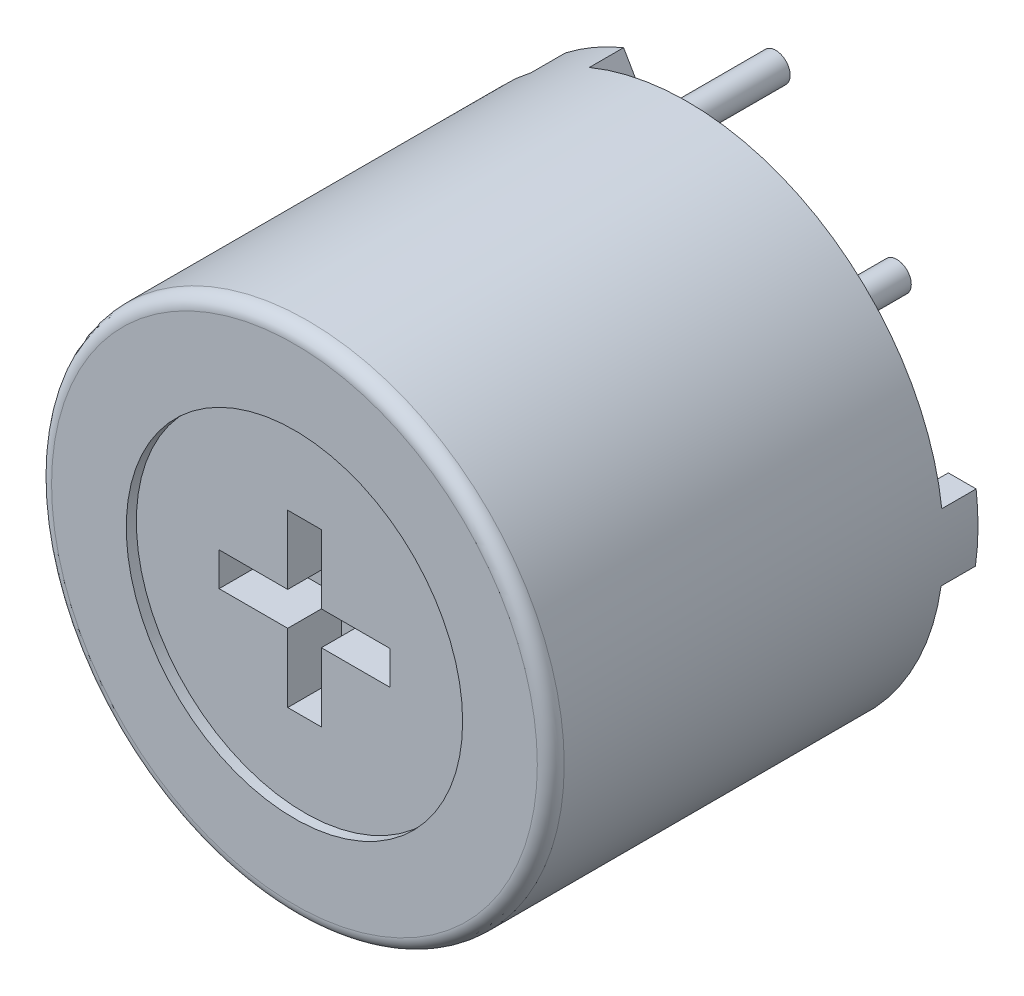
ISO-10303-21;
HEADER;
FILE_DESCRIPTION(('STEP AP214'),'2;1');
FILE_NAME('part.step','',(''),(''),'','','');
FILE_SCHEMA(('AUTOMOTIVE_DESIGN { 1 0 10303 214 1 1 1 1 }'));
ENDSEC;
DATA;
#1=APPLICATION_CONTEXT('core data for automotive mechanical design processes');
#2=APPLICATION_PROTOCOL_DEFINITION('international standard','automotive_design',2000,#1);
#3=PRODUCT_CONTEXT('',#1,'mechanical');
#4=PRODUCT('Part','Part','',(#3));
#5=PRODUCT_RELATED_PRODUCT_CATEGORY('part','',(#4));
#6=PRODUCT_DEFINITION_FORMATION('','',#4);
#7=PRODUCT_DEFINITION_CONTEXT('part definition',#1,'design');
#8=PRODUCT_DEFINITION('design','',#6,#7);
#9=PRODUCT_DEFINITION_SHAPE('','',#8);
#10=(LENGTH_UNIT() NAMED_UNIT(*) SI_UNIT(.MILLI.,.METRE.));
#11=(NAMED_UNIT(*) PLANE_ANGLE_UNIT() SI_UNIT($,.RADIAN.));
#12=(NAMED_UNIT(*) SI_UNIT($,.STERADIAN.) SOLID_ANGLE_UNIT());
#13=UNCERTAINTY_MEASURE_WITH_UNIT(LENGTH_MEASURE(1.E-05),#10,'distance_accuracy_value','');
#14=(GEOMETRIC_REPRESENTATION_CONTEXT(3) GLOBAL_UNCERTAINTY_ASSIGNED_CONTEXT((#13)) GLOBAL_UNIT_ASSIGNED_CONTEXT((#10,
#11,#12)) REPRESENTATION_CONTEXT('',''));
#15=CARTESIAN_POINT('',(0.,0.,0.));
#16=DIRECTION('',(0.,0.,1.));
#17=DIRECTION('',(1.,0.,0.));
#18=AXIS2_PLACEMENT_3D('',#15,#16,#17);
#19=CARTESIAN_POINT('',(80.627,48.84,6.9));
#20=DIRECTION('',(0.,0.,1.));
#21=DIRECTION('',(1.,0.,0.));
#22=AXIS2_PLACEMENT_3D('',#19,#20,#21);
#23=PLANE('',#22);
#24=DIRECTION('',(1.,0.,0.));
#25=VECTOR('',#24,1.);
#26=CARTESIAN_POINT('',(80.627,48.84,6.9));
#27=LINE('',#26,#25);
#28=CARTESIAN_POINT('',(83.167,48.84,6.9));
#29=VERTEX_POINT('',#28);
#30=CARTESIAN_POINT('',(82.147,48.84,6.9));
#31=VERTEX_POINT('',#30);
#32=EDGE_CURVE('E404',#29,#31,#27,.F.);
#33=ORIENTED_EDGE('',*,*,#32,.F.);
#34=DIRECTION('',(0.,1.,0.));
#35=VECTOR('',#34,1.);
#36=CARTESIAN_POINT('',(83.167,48.84,6.9));
#37=LINE('',#36,#35);
#38=CARTESIAN_POINT('',(83.167,49.34,6.9));
#39=VERTEX_POINT('',#38);
#40=EDGE_CURVE('E410',#29,#39,#37,.T.);
#41=ORIENTED_EDGE('',*,*,#40,.T.);
#42=DIRECTION('',(1.,0.,0.));
#43=VECTOR('',#42,1.);
#44=CARTESIAN_POINT('',(80.627,49.34,6.9));
#45=LINE('',#44,#43);
#46=CARTESIAN_POINT('',(82.147,49.34,6.9));
#47=VERTEX_POINT('',#46);
#48=EDGE_CURVE('E416',#39,#47,#45,.F.);
#49=ORIENTED_EDGE('',*,*,#48,.T.);
#50=DIRECTION('',(0.,1.,0.));
#51=VECTOR('',#50,1.);
#52=CARTESIAN_POINT('',(82.147,47.82,6.9));
#53=LINE('',#52,#51);
#54=CARTESIAN_POINT('',(82.147,50.36,6.9));
#55=VERTEX_POINT('',#54);
#56=EDGE_CURVE('E422',#47,#55,#53,.T.);
#57=ORIENTED_EDGE('',*,*,#56,.T.);
#58=DIRECTION('',(1.,0.,0.));
#59=VECTOR('',#58,1.);
#60=CARTESIAN_POINT('',(81.647,50.36,6.9));
#61=LINE('',#60,#59);
#62=CARTESIAN_POINT('',(81.647,50.36,6.9));
#63=VERTEX_POINT('',#62);
#64=EDGE_CURVE('E428',#55,#63,#61,.F.);
#65=ORIENTED_EDGE('',*,*,#64,.T.);
#66=DIRECTION('',(0.,1.,0.));
#67=VECTOR('',#66,1.);
#68=CARTESIAN_POINT('',(81.647,47.82,6.9));
#69=LINE('',#68,#67);
#70=CARTESIAN_POINT('',(81.647,49.34,6.9));
#71=VERTEX_POINT('',#70);
#72=EDGE_CURVE('E431',#71,#63,#69,.T.);
#73=ORIENTED_EDGE('',*,*,#72,.F.);
#74=DIRECTION('',(1.,0.,0.));
#75=VECTOR('',#74,1.);
#76=CARTESIAN_POINT('',(80.627,49.34,6.9));
#77=LINE('',#76,#75);
#78=CARTESIAN_POINT('',(80.627,49.34,6.9));
#79=VERTEX_POINT('',#78);
#80=EDGE_CURVE('E440',#71,#79,#77,.F.);
#81=ORIENTED_EDGE('',*,*,#80,.T.);
#82=DIRECTION('',(0.,1.,0.));
#83=VECTOR('',#82,1.);
#84=CARTESIAN_POINT('',(80.627,48.84,6.9));
#85=LINE('',#84,#83);
#86=CARTESIAN_POINT('',(80.627,48.84,6.9));
#87=VERTEX_POINT('',#86);
#88=EDGE_CURVE('E443',#87,#79,#85,.T.);
#89=ORIENTED_EDGE('',*,*,#88,.F.);
#90=DIRECTION('',(1.,0.,0.));
#91=VECTOR('',#90,1.);
#92=CARTESIAN_POINT('',(80.627,48.84,6.9));
#93=LINE('',#92,#91);
#94=CARTESIAN_POINT('',(81.647,48.84,6.9));
#95=VERTEX_POINT('',#94);
#96=EDGE_CURVE('E452',#95,#87,#93,.F.);
#97=ORIENTED_EDGE('',*,*,#96,.F.);
#98=DIRECTION('',(0.,1.,0.));
#99=VECTOR('',#98,1.);
#100=CARTESIAN_POINT('',(81.647,47.82,6.9));
#101=LINE('',#100,#99);
#102=CARTESIAN_POINT('',(81.647,47.82,6.9));
#103=VERTEX_POINT('',#102);
#104=EDGE_CURVE('E455',#103,#95,#101,.T.);
#105=ORIENTED_EDGE('',*,*,#104,.F.);
#106=DIRECTION('',(1.,0.,0.));
#107=VECTOR('',#106,1.);
#108=CARTESIAN_POINT('',(81.647,47.82,6.9));
#109=LINE('',#108,#107);
#110=CARTESIAN_POINT('',(82.147,47.82,6.9));
#111=VERTEX_POINT('',#110);
#112=EDGE_CURVE('E461',#111,#103,#109,.F.);
#113=ORIENTED_EDGE('',*,*,#112,.F.);
#114=DIRECTION('',(0.,1.,0.));
#115=VECTOR('',#114,1.);
#116=CARTESIAN_POINT('',(82.147,47.82,6.9));
#117=LINE('',#116,#115);
#118=EDGE_CURVE('E467',#111,#31,#117,.T.);
#119=ORIENTED_EDGE('',*,*,#118,.T.);
#120=EDGE_LOOP('',(#33,#41,#49,#57,#65,#73,#81,#89,#97,#105,#113,#119));
#121=FACE_BOUND('',#120,.T.);
#122=ADVANCED_FACE('F17',(#121),#23,.T.);
#123=CARTESIAN_POINT('',(81.88,49.08,-1.1));
#124=DIRECTION('',(0.,0.,1.));
#125=DIRECTION('',(1.,0.,0.));
#126=AXIS2_PLACEMENT_3D('',#123,#124,#125);
#127=PLANE('',#126);
#128=CARTESIAN_POINT('',(81.9,49.1,-1.1));
#129=DIRECTION('',(0.,0.,1.));
#130=DIRECTION('',(1.,0.,0.));
#131=AXIS2_PLACEMENT_3D('',#128,#129,#130);
#132=CIRCLE('',#131,0.215);
#133=CARTESIAN_POINT('',(82.115,49.1,-1.1));
#134=VERTEX_POINT('',#133);
#135=EDGE_CURVE('E20',#134,#134,#132,.T.);
#136=ORIENTED_EDGE('',*,*,#135,.F.);
#137=EDGE_LOOP('',(#136));
#138=FACE_BOUND('',#137,.T.);
#139=ADVANCED_FACE('F268',(#138),#127,.F.);
#140=CARTESIAN_POINT('',(82.147,47.82,6.9));
#141=DIRECTION('',(1.,0.,0.));
#142=DIRECTION('',(0.,0.,-1.));
#143=AXIS2_PLACEMENT_3D('',#140,#141,#142);
#144=PLANE('',#143);
#145=DIRECTION('',(0.,0.,1.));
#146=VECTOR('',#145,1.);
#147=CARTESIAN_POINT('',(82.147,48.84,6.9));
#148=LINE('',#147,#146);
#149=CARTESIAN_POINT('',(82.147,48.84,7.7));
#150=VERTEX_POINT('',#149);
#151=EDGE_CURVE('E401',#31,#150,#148,.T.);
#152=ORIENTED_EDGE('',*,*,#151,.F.);
#153=ORIENTED_EDGE('',*,*,#118,.F.);
#154=DIRECTION('',(0.,0.,1.));
#155=VECTOR('',#154,1.);
#156=CARTESIAN_POINT('',(82.147,47.82,6.9));
#157=LINE('',#156,#155);
#158=CARTESIAN_POINT('',(82.147,47.82,7.7));
#159=VERTEX_POINT('',#158);
#160=EDGE_CURVE('E464',#159,#111,#157,.F.);
#161=ORIENTED_EDGE('',*,*,#160,.F.);
#162=DIRECTION('',(0.,1.,0.));
#163=VECTOR('',#162,1.);
#164=CARTESIAN_POINT('',(82.147,49.09,7.7));
#165=LINE('',#164,#163);
#166=EDGE_CURVE('E396',#150,#159,#165,.F.);
#167=ORIENTED_EDGE('',*,*,#166,.F.);
#168=EDGE_LOOP('',(#152,#153,#161,#167));
#169=FACE_BOUND('',#168,.T.);
#170=ADVANCED_FACE('F265',(#169),#144,.F.);
#171=CARTESIAN_POINT('',(81.647,47.82,6.9));
#172=DIRECTION('',(0.,1.,0.));
#173=DIRECTION('',(0.,0.,1.));
#174=AXIS2_PLACEMENT_3D('',#171,#172,#173);
#175=PLANE('',#174);
#176=DIRECTION('',(0.,0.,-1.));
#177=VECTOR('',#176,1.);
#178=CARTESIAN_POINT('',(81.647,47.82,6.9));
#179=LINE('',#178,#177);
#180=CARTESIAN_POINT('',(81.647,47.82,7.7));
#181=VERTEX_POINT('',#180);
#182=EDGE_CURVE('E458',#181,#103,#179,.T.);
#183=ORIENTED_EDGE('',*,*,#182,.F.);
#184=DIRECTION('',(1.,0.,0.));
#185=VECTOR('',#184,1.);
#186=CARTESIAN_POINT('',(81.897,47.82,7.7));
#187=LINE('',#186,#185);
#188=EDGE_CURVE('E393',#159,#181,#187,.F.);
#189=ORIENTED_EDGE('',*,*,#188,.F.);
#190=ORIENTED_EDGE('',*,*,#160,.T.);
#191=ORIENTED_EDGE('',*,*,#112,.T.);
#192=EDGE_LOOP('',(#183,#189,#190,#191));
#193=FACE_BOUND('',#192,.T.);
#194=ADVANCED_FACE('F261',(#193),#175,.T.);
#195=CARTESIAN_POINT('',(81.647,47.82,6.9));
#196=DIRECTION('',(1.,0.,0.));
#197=DIRECTION('',(0.,0.,-1.));
#198=AXIS2_PLACEMENT_3D('',#195,#196,#197);
#199=PLANE('',#198);
#200=DIRECTION('',(0.,0.,1.));
#201=VECTOR('',#200,1.);
#202=CARTESIAN_POINT('',(81.647,48.84,6.9));
#203=LINE('',#202,#201);
#204=CARTESIAN_POINT('',(81.647,48.84,7.7));
#205=VERTEX_POINT('',#204);
#206=EDGE_CURVE('E449',#205,#95,#203,.F.);
#207=ORIENTED_EDGE('',*,*,#206,.F.);
#208=DIRECTION('',(0.,1.,0.));
#209=VECTOR('',#208,1.);
#210=CARTESIAN_POINT('',(81.647,49.09,7.7));
#211=LINE('',#210,#209);
#212=EDGE_CURVE('E390',#181,#205,#211,.T.);
#213=ORIENTED_EDGE('',*,*,#212,.F.);
#214=ORIENTED_EDGE('',*,*,#182,.T.);
#215=ORIENTED_EDGE('',*,*,#104,.T.);
#216=EDGE_LOOP('',(#207,#213,#214,#215));
#217=FACE_BOUND('',#216,.T.);
#218=ADVANCED_FACE('F257',(#217),#199,.T.);
#219=CARTESIAN_POINT('',(80.627,48.84,6.9));
#220=DIRECTION('',(0.,1.,0.));
#221=DIRECTION('',(0.,0.,1.));
#222=AXIS2_PLACEMENT_3D('',#219,#220,#221);
#223=PLANE('',#222);
#224=DIRECTION('',(1.,0.,0.));
#225=VECTOR('',#224,1.);
#226=CARTESIAN_POINT('',(81.897,48.84,7.7));
#227=LINE('',#226,#225);
#228=CARTESIAN_POINT('',(80.627,48.84,7.7));
#229=VERTEX_POINT('',#228);
#230=EDGE_CURVE('E387',#205,#229,#227,.F.);
#231=ORIENTED_EDGE('',*,*,#230,.F.);
#232=ORIENTED_EDGE('',*,*,#206,.T.);
#233=ORIENTED_EDGE('',*,*,#96,.T.);
#234=DIRECTION('',(0.,0.,-1.));
#235=VECTOR('',#234,1.);
#236=CARTESIAN_POINT('',(80.627,48.84,6.9));
#237=LINE('',#236,#235);
#238=EDGE_CURVE('E446',#229,#87,#237,.T.);
#239=ORIENTED_EDGE('',*,*,#238,.F.);
#240=EDGE_LOOP('',(#231,#232,#233,#239));
#241=FACE_BOUND('',#240,.T.);
#242=ADVANCED_FACE('F253',(#241),#223,.T.);
#243=CARTESIAN_POINT('',(80.627,48.84,6.9));
#244=DIRECTION('',(1.,0.,0.));
#245=DIRECTION('',(0.,0.,-1.));
#246=AXIS2_PLACEMENT_3D('',#243,#244,#245);
#247=PLANE('',#246);
#248=DIRECTION('',(0.,0.,1.));
#249=VECTOR('',#248,1.);
#250=CARTESIAN_POINT('',(80.627,49.34,6.9));
#251=LINE('',#250,#249);
#252=CARTESIAN_POINT('',(80.627,49.34,7.7));
#253=VERTEX_POINT('',#252);
#254=EDGE_CURVE('E437',#79,#253,#251,.T.);
#255=ORIENTED_EDGE('',*,*,#254,.T.);
#256=DIRECTION('',(0.,1.,0.));
#257=VECTOR('',#256,1.);
#258=CARTESIAN_POINT('',(80.627,49.09,7.7));
#259=LINE('',#258,#257);
#260=EDGE_CURVE('E384',#229,#253,#259,.T.);
#261=ORIENTED_EDGE('',*,*,#260,.F.);
#262=ORIENTED_EDGE('',*,*,#238,.T.);
#263=ORIENTED_EDGE('',*,*,#88,.T.);
#264=EDGE_LOOP('',(#255,#261,#262,#263));
#265=FACE_BOUND('',#264,.T.);
#266=ADVANCED_FACE('F249',(#265),#247,.T.);
#267=CARTESIAN_POINT('',(80.627,49.34,6.9));
#268=DIRECTION('',(0.,1.,0.));
#269=DIRECTION('',(0.,0.,1.));
#270=AXIS2_PLACEMENT_3D('',#267,#268,#269);
#271=PLANE('',#270);
#272=DIRECTION('',(1.,0.,0.));
#273=VECTOR('',#272,1.);
#274=CARTESIAN_POINT('',(81.897,49.34,7.7));
#275=LINE('',#274,#273);
#276=CARTESIAN_POINT('',(81.647,49.34,7.7));
#277=VERTEX_POINT('',#276);
#278=EDGE_CURVE('E381',#253,#277,#275,.T.);
#279=ORIENTED_EDGE('',*,*,#278,.F.);
#280=ORIENTED_EDGE('',*,*,#254,.F.);
#281=ORIENTED_EDGE('',*,*,#80,.F.);
#282=DIRECTION('',(0.,0.,-1.));
#283=VECTOR('',#282,1.);
#284=CARTESIAN_POINT('',(81.647,49.34,6.9));
#285=LINE('',#284,#283);
#286=EDGE_CURVE('E434',#277,#71,#285,.T.);
#287=ORIENTED_EDGE('',*,*,#286,.F.);
#288=EDGE_LOOP('',(#279,#280,#281,#287));
#289=FACE_BOUND('',#288,.T.);
#290=ADVANCED_FACE('F245',(#289),#271,.F.);
#291=CARTESIAN_POINT('',(81.647,47.82,6.9));
#292=DIRECTION('',(1.,0.,0.));
#293=DIRECTION('',(0.,0.,-1.));
#294=AXIS2_PLACEMENT_3D('',#291,#292,#293);
#295=PLANE('',#294);
#296=DIRECTION('',(0.,0.,1.));
#297=VECTOR('',#296,1.);
#298=CARTESIAN_POINT('',(81.647,50.36,6.9));
#299=LINE('',#298,#297);
#300=CARTESIAN_POINT('',(81.647,50.36,7.7));
#301=VERTEX_POINT('',#300);
#302=EDGE_CURVE('E425',#63,#301,#299,.T.);
#303=ORIENTED_EDGE('',*,*,#302,.T.);
#304=DIRECTION('',(0.,1.,0.));
#305=VECTOR('',#304,1.);
#306=CARTESIAN_POINT('',(81.647,49.09,7.7));
#307=LINE('',#306,#305);
#308=EDGE_CURVE('E378',#277,#301,#307,.T.);
#309=ORIENTED_EDGE('',*,*,#308,.F.);
#310=ORIENTED_EDGE('',*,*,#286,.T.);
#311=ORIENTED_EDGE('',*,*,#72,.T.);
#312=EDGE_LOOP('',(#303,#309,#310,#311));
#313=FACE_BOUND('',#312,.T.);
#314=ADVANCED_FACE('F241',(#313),#295,.T.);
#315=CARTESIAN_POINT('',(81.647,50.36,6.9));
#316=DIRECTION('',(0.,1.,0.));
#317=DIRECTION('',(0.,0.,1.));
#318=AXIS2_PLACEMENT_3D('',#315,#316,#317);
#319=PLANE('',#318);
#320=ORIENTED_EDGE('',*,*,#302,.F.);
#321=ORIENTED_EDGE('',*,*,#64,.F.);
#322=DIRECTION('',(0.,0.,-1.));
#323=VECTOR('',#322,1.);
#324=CARTESIAN_POINT('',(82.147,50.36,6.9));
#325=LINE('',#324,#323);
#326=CARTESIAN_POINT('',(82.147,50.36,7.7));
#327=VERTEX_POINT('',#326);
#328=EDGE_CURVE('E419',#55,#327,#325,.F.);
#329=ORIENTED_EDGE('',*,*,#328,.T.);
#330=DIRECTION('',(1.,0.,0.));
#331=VECTOR('',#330,1.);
#332=CARTESIAN_POINT('',(81.897,50.36,7.7));
#333=LINE('',#332,#331);
#334=EDGE_CURVE('E375',#301,#327,#333,.T.);
#335=ORIENTED_EDGE('',*,*,#334,.F.);
#336=EDGE_LOOP('',(#320,#321,#329,#335));
#337=FACE_BOUND('',#336,.T.);
#338=ADVANCED_FACE('F237',(#337),#319,.F.);
#339=CARTESIAN_POINT('',(82.147,47.82,6.9));
#340=DIRECTION('',(1.,0.,0.));
#341=DIRECTION('',(0.,0.,-1.));
#342=AXIS2_PLACEMENT_3D('',#339,#340,#341);
#343=PLANE('',#342);
#344=ORIENTED_EDGE('',*,*,#328,.F.);
#345=ORIENTED_EDGE('',*,*,#56,.F.);
#346=DIRECTION('',(0.,0.,1.));
#347=VECTOR('',#346,1.);
#348=CARTESIAN_POINT('',(82.147,49.34,6.9));
#349=LINE('',#348,#347);
#350=CARTESIAN_POINT('',(82.147,49.34,7.7));
#351=VERTEX_POINT('',#350);
#352=EDGE_CURVE('E413',#47,#351,#349,.T.);
#353=ORIENTED_EDGE('',*,*,#352,.T.);
#354=DIRECTION('',(0.,1.,0.));
#355=VECTOR('',#354,1.);
#356=CARTESIAN_POINT('',(82.147,49.09,7.7));
#357=LINE('',#356,#355);
#358=EDGE_CURVE('E372',#327,#351,#357,.F.);
#359=ORIENTED_EDGE('',*,*,#358,.F.);
#360=EDGE_LOOP('',(#344,#345,#353,#359));
#361=FACE_BOUND('',#360,.T.);
#362=ADVANCED_FACE('F233',(#361),#343,.F.);
#363=CARTESIAN_POINT('',(80.627,49.34,6.9));
#364=DIRECTION('',(0.,1.,0.));
#365=DIRECTION('',(0.,0.,1.));
#366=AXIS2_PLACEMENT_3D('',#363,#364,#365);
#367=PLANE('',#366);
#368=DIRECTION('',(1.,0.,0.));
#369=VECTOR('',#368,1.);
#370=CARTESIAN_POINT('',(81.897,49.34,7.7));
#371=LINE('',#370,#369);
#372=CARTESIAN_POINT('',(83.167,49.34,7.7));
#373=VERTEX_POINT('',#372);
#374=EDGE_CURVE('E366',#351,#373,#371,.T.);
#375=ORIENTED_EDGE('',*,*,#374,.F.);
#376=ORIENTED_EDGE('',*,*,#352,.F.);
#377=ORIENTED_EDGE('',*,*,#48,.F.);
#378=DIRECTION('',(0.,0.,-1.));
#379=VECTOR('',#378,1.);
#380=CARTESIAN_POINT('',(83.167,49.34,6.9));
#381=LINE('',#380,#379);
#382=EDGE_CURVE('E407',#39,#373,#381,.F.);
#383=ORIENTED_EDGE('',*,*,#382,.T.);
#384=EDGE_LOOP('',(#375,#376,#377,#383));
#385=FACE_BOUND('',#384,.T.);
#386=ADVANCED_FACE('F229',(#385),#367,.F.);
#387=CARTESIAN_POINT('',(83.167,48.84,6.9));
#388=DIRECTION('',(1.,0.,0.));
#389=DIRECTION('',(0.,0.,-1.));
#390=AXIS2_PLACEMENT_3D('',#387,#388,#389);
#391=PLANE('',#390);
#392=ORIENTED_EDGE('',*,*,#382,.F.);
#393=ORIENTED_EDGE('',*,*,#40,.F.);
#394=DIRECTION('',(0.,0.,1.));
#395=VECTOR('',#394,1.);
#396=CARTESIAN_POINT('',(83.167,48.84,6.9));
#397=LINE('',#396,#395);
#398=CARTESIAN_POINT('',(83.167,48.84,7.7));
#399=VERTEX_POINT('',#398);
#400=EDGE_CURVE('E398',#399,#29,#397,.F.);
#401=ORIENTED_EDGE('',*,*,#400,.F.);
#402=DIRECTION('',(0.,1.,0.));
#403=VECTOR('',#402,1.);
#404=CARTESIAN_POINT('',(83.167,49.09,7.7));
#405=LINE('',#404,#403);
#406=EDGE_CURVE('E360',#373,#399,#405,.F.);
#407=ORIENTED_EDGE('',*,*,#406,.F.);
#408=EDGE_LOOP('',(#392,#393,#401,#407));
#409=FACE_BOUND('',#408,.T.);
#410=ADVANCED_FACE('F225',(#409),#391,.F.);
#411=CARTESIAN_POINT('',(80.627,48.84,6.9));
#412=DIRECTION('',(0.,1.,0.));
#413=DIRECTION('',(0.,0.,1.));
#414=AXIS2_PLACEMENT_3D('',#411,#412,#413);
#415=PLANE('',#414);
#416=DIRECTION('',(1.,0.,0.));
#417=VECTOR('',#416,1.);
#418=CARTESIAN_POINT('',(81.897,48.84,7.7));
#419=LINE('',#418,#417);
#420=EDGE_CURVE('E356',#399,#150,#419,.F.);
#421=ORIENTED_EDGE('',*,*,#420,.F.);
#422=ORIENTED_EDGE('',*,*,#400,.T.);
#423=ORIENTED_EDGE('',*,*,#32,.T.);
#424=ORIENTED_EDGE('',*,*,#151,.T.);
#425=EDGE_LOOP('',(#421,#422,#423,#424));
#426=FACE_BOUND('',#425,.T.);
#427=ADVANCED_FACE('F221',(#426),#415,.T.);
#428=CARTESIAN_POINT('',(81.88,49.08,-1.1));
#429=DIRECTION('',(0.,0.,1.));
#430=DIRECTION('',(1.,0.,0.));
#431=AXIS2_PLACEMENT_3D('',#428,#429,#430);
#432=PLANE('',#431);
#433=CARTESIAN_POINT('',(80.1,50.8921,-1.1));
#434=DIRECTION('',(0.,0.,1.));
#435=DIRECTION('',(1.,0.,0.));
#436=AXIS2_PLACEMENT_3D('',#433,#434,#435);
#437=CIRCLE('',#436,0.215);
#438=CARTESIAN_POINT('',(80.315,50.8921,-1.1));
#439=VERTEX_POINT('',#438);
#440=EDGE_CURVE('E354',#439,#439,#437,.T.);
#441=ORIENTED_EDGE('',*,*,#440,.F.);
#442=EDGE_LOOP('',(#441));
#443=FACE_BOUND('',#442,.T.);
#444=ADVANCED_FACE('F217',(#443),#432,.F.);
#445=CARTESIAN_POINT('',(81.88,49.08,-1.1));
#446=DIRECTION('',(0.,0.,1.));
#447=DIRECTION('',(1.,0.,0.));
#448=AXIS2_PLACEMENT_3D('',#445,#446,#447);
#449=PLANE('',#448);
#450=CARTESIAN_POINT('',(80.1,47.3,-1.1));
#451=DIRECTION('',(0.,0.,1.));
#452=DIRECTION('',(1.,0.,0.));
#453=AXIS2_PLACEMENT_3D('',#450,#451,#452);
#454=CIRCLE('',#453,0.215);
#455=CARTESIAN_POINT('',(80.315,47.3,-1.1));
#456=VERTEX_POINT('',#455);
#457=EDGE_CURVE('E352',#456,#456,#454,.T.);
#458=ORIENTED_EDGE('',*,*,#457,.F.);
#459=EDGE_LOOP('',(#458));
#460=FACE_BOUND('',#459,.T.);
#461=ADVANCED_FACE('F213',(#460),#449,.F.);
#462=CARTESIAN_POINT('',(81.9,49.1,-3.28));
#463=DIRECTION('',(0.,0.,1.));
#464=DIRECTION('',(1.,0.,0.));
#465=AXIS2_PLACEMENT_3D('',#462,#463,#464);
#466=CYLINDRICAL_SURFACE('',#465,0.215);
#467=CARTESIAN_POINT('',(81.9,49.1,2.01));
#468=DIRECTION('',(0.,0.,1.));
#469=DIRECTION('',(1.,0.,0.));
#470=AXIS2_PLACEMENT_3D('',#467,#468,#469);
#471=CIRCLE('',#470,0.215);
#472=CARTESIAN_POINT('',(82.115,49.1,2.01));
#473=VERTEX_POINT('',#472);
#474=EDGE_CURVE('E349',#473,#473,#471,.F.);
#475=ORIENTED_EDGE('',*,*,#474,.T.);
#476=EDGE_LOOP('',(#475));
#477=FACE_BOUND('',#476,.T.);
#478=ORIENTED_EDGE('',*,*,#135,.T.);
#479=EDGE_LOOP('',(#478));
#480=FACE_BOUND('',#479,.T.);
#481=ADVANCED_FACE('F209',(#477,#480),#466,.T.);
#482=CARTESIAN_POINT('',(81.897,49.09,7.7));
#483=DIRECTION('',(0.,0.,1.));
#484=DIRECTION('',(1.,0.,0.));
#485=AXIS2_PLACEMENT_3D('',#482,#483,#484);
#486=PLANE('',#485);
#487=ORIENTED_EDGE('',*,*,#406,.T.);
#488=ORIENTED_EDGE('',*,*,#420,.T.);
#489=ORIENTED_EDGE('',*,*,#166,.T.);
#490=ORIENTED_EDGE('',*,*,#188,.T.);
#491=ORIENTED_EDGE('',*,*,#212,.T.);
#492=ORIENTED_EDGE('',*,*,#230,.T.);
#493=ORIENTED_EDGE('',*,*,#260,.T.);
#494=ORIENTED_EDGE('',*,*,#278,.T.);
#495=ORIENTED_EDGE('',*,*,#308,.T.);
#496=ORIENTED_EDGE('',*,*,#334,.T.);
#497=ORIENTED_EDGE('',*,*,#358,.T.);
#498=ORIENTED_EDGE('',*,*,#374,.T.);
#499=EDGE_LOOP('',(#487,#488,#489,#490,#491,#492,#493,#494,#495,#496,#497,#498));
#500=FACE_BOUND('',#499,.T.);
#501=CARTESIAN_POINT('',(81.897,49.09,7.7));
#502=DIRECTION('',(0.,0.,1.));
#503=DIRECTION('',(1.,0.,0.));
#504=AXIS2_PLACEMENT_3D('',#501,#502,#503);
#505=CIRCLE('',#504,2.5);
#506=CARTESIAN_POINT('',(84.397,49.09,7.7));
#507=VERTEX_POINT('',#506);
#508=EDGE_CURVE('E119',#507,#507,#505,.T.);
#509=ORIENTED_EDGE('',*,*,#508,.T.);
#510=EDGE_LOOP('',(#509));
#511=FACE_BOUND('',#510,.T.);
#512=ADVANCED_FACE('F205',(#500,#511),#486,.T.);
#513=CARTESIAN_POINT('',(80.1,50.8921,-3.28));
#514=DIRECTION('',(0.,0.,1.));
#515=DIRECTION('',(1.,0.,0.));
#516=AXIS2_PLACEMENT_3D('',#513,#514,#515);
#517=CYLINDRICAL_SURFACE('',#516,0.215);
#518=CARTESIAN_POINT('',(80.1,50.8921,2.01));
#519=DIRECTION('',(0.,0.,1.));
#520=DIRECTION('',(1.,0.,0.));
#521=AXIS2_PLACEMENT_3D('',#518,#519,#520);
#522=CIRCLE('',#521,0.215);
#523=CARTESIAN_POINT('',(80.315,50.8921,2.01));
#524=VERTEX_POINT('',#523);
#525=EDGE_CURVE('E118',#524,#524,#522,.F.);
#526=ORIENTED_EDGE('',*,*,#525,.T.);
#527=EDGE_LOOP('',(#526));
#528=FACE_BOUND('',#527,.T.);
#529=ORIENTED_EDGE('',*,*,#440,.T.);
#530=EDGE_LOOP('',(#529));
#531=FACE_BOUND('',#530,.T.);
#532=ADVANCED_FACE('F201',(#528,#531),#517,.T.);
#533=CARTESIAN_POINT('',(80.1,47.3,-3.28));
#534=DIRECTION('',(0.,0.,1.));
#535=DIRECTION('',(1.,0.,0.));
#536=AXIS2_PLACEMENT_3D('',#533,#534,#535);
#537=CYLINDRICAL_SURFACE('',#536,0.215);
#538=CARTESIAN_POINT('',(80.1,47.3,2.01));
#539=DIRECTION('',(0.,0.,1.));
#540=DIRECTION('',(1.,0.,0.));
#541=AXIS2_PLACEMENT_3D('',#538,#539,#540);
#542=CIRCLE('',#541,0.215);
#543=CARTESIAN_POINT('',(80.315,47.3,2.01));
#544=VERTEX_POINT('',#543);
#545=EDGE_CURVE('E342',#544,#544,#542,.F.);
#546=ORIENTED_EDGE('',*,*,#545,.T.);
#547=EDGE_LOOP('',(#546));
#548=FACE_BOUND('',#547,.T.);
#549=ORIENTED_EDGE('',*,*,#457,.T.);
#550=EDGE_LOOP('',(#549));
#551=FACE_BOUND('',#550,.T.);
#552=ADVANCED_FACE('F197',(#548,#551),#537,.T.);
#553=CARTESIAN_POINT('',(81.897,49.09,6.));
#554=DIRECTION('',(0.,0.,1.));
#555=DIRECTION('',(1.,0.,0.));
#556=AXIS2_PLACEMENT_3D('',#553,#554,#555);
#557=CYLINDRICAL_SURFACE('',#556,2.5);
#558=CARTESIAN_POINT('',(81.897,49.09,7.85));
#559=DIRECTION('',(0.,0.,1.));
#560=DIRECTION('',(1.,0.,0.));
#561=AXIS2_PLACEMENT_3D('',#558,#559,#560);
#562=CIRCLE('',#561,2.5);
#563=CARTESIAN_POINT('',(84.397,49.09,7.85));
#564=VERTEX_POINT('',#563);
#565=EDGE_CURVE('E335',#564,#564,#562,.F.);
#566=ORIENTED_EDGE('',*,*,#565,.F.);
#567=EDGE_LOOP('',(#566));
#568=FACE_BOUND('',#567,.T.);
#569=ORIENTED_EDGE('',*,*,#508,.F.);
#570=EDGE_LOOP('',(#569));
#571=FACE_BOUND('',#570,.T.);
#572=ADVANCED_FACE('F194',(#568,#571),#557,.F.);
#573=CARTESIAN_POINT('',(81.897,49.09,1.41));
#574=DIRECTION('',(0.,0.,1.));
#575=DIRECTION('',(1.,0.,0.));
#576=AXIS2_PLACEMENT_3D('',#573,#574,#575);
#577=CYLINDRICAL_SURFACE('',#576,3.4);
#578=CARTESIAN_POINT('',(81.897,49.09,1.5));
#579=DIRECTION('',(0.,0.,1.));
#580=DIRECTION('',(1.,0.,0.));
#581=AXIS2_PLACEMENT_3D('',#578,#579,#580);
#582=CIRCLE('',#581,3.4);
#583=CARTESIAN_POINT('',(79.7808468463372,51.751183163603,1.5));
#584=VERTEX_POINT('',#583);
#585=CARTESIAN_POINT('',(80.6465673457187,52.2517112735206,1.5));
#586=VERTEX_POINT('',#585);
#587=EDGE_CURVE('E128',#584,#586,#582,.F.);
#588=ORIENTED_EDGE('',*,*,#587,.T.);
#589=DIRECTION('',(0.,0.,1.));
#590=VECTOR('',#589,1.);
#591=CARTESIAN_POINT('',(80.6465673457181,52.2517112735205,1.41));
#592=LINE('',#591,#590);
#593=CARTESIAN_POINT('',(80.6465673457187,52.2517112735205,2.01));
#594=VERTEX_POINT('',#593);
#595=EDGE_CURVE('E113',#594,#586,#592,.F.);
#596=ORIENTED_EDGE('',*,*,#595,.F.);
#597=CARTESIAN_POINT('',(81.897,49.09,2.01));
#598=DIRECTION('',(0.,0.,1.));
#599=DIRECTION('',(1.,0.,0.));
#600=AXIS2_PLACEMENT_3D('',#597,#598,#599);
#601=CIRCLE('',#600,3.4);
#602=CARTESIAN_POINT('',(79.7808468463371,51.7511831636029,2.01));
#603=VERTEX_POINT('',#602);
#604=EDGE_CURVE('E107',#603,#594,#601,.F.);
#605=ORIENTED_EDGE('',*,*,#604,.F.);
#606=DIRECTION('',(0.,0.,1.));
#607=VECTOR('',#606,1.);
#608=CARTESIAN_POINT('',(79.7808468463371,51.7511831636031,1.41));
#609=LINE('',#608,#607);
#610=EDGE_CURVE('E111',#603,#584,#609,.F.);
#611=ORIENTED_EDGE('',*,*,#610,.T.);
#612=EDGE_LOOP('',(#588,#596,#605,#611));
#613=FACE_BOUND('',#612,.T.);
#614=ADVANCED_FACE('F110',(#613),#577,.F.);
#615=CARTESIAN_POINT('',(81.897,49.09,1.41));
#616=DIRECTION('',(0.,0.,1.));
#617=DIRECTION('',(1.,0.,0.));
#618=AXIS2_PLACEMENT_3D('',#615,#616,#617);
#619=CYLINDRICAL_SURFACE('',#618,3.4);
#620=CARTESIAN_POINT('',(81.897,49.09,1.5));
#621=DIRECTION('',(0.,0.,1.));
#622=DIRECTION('',(1.,0.,0.));
#623=AXIS2_PLACEMENT_3D('',#620,#621,#622);
#624=CIRCLE('',#623,3.4);
#625=CARTESIAN_POINT('',(80.6504243530274,45.9267660288283,1.5));
#626=VERTEX_POINT('',#625);
#627=CARTESIAN_POINT('',(79.7840940448401,46.4262379189108,1.5));
#628=VERTEX_POINT('',#627);
#629=EDGE_CURVE('E319',#626,#628,#624,.F.);
#630=ORIENTED_EDGE('',*,*,#629,.T.);
#631=DIRECTION('',(0.,0.,1.));
#632=VECTOR('',#631,1.);
#633=CARTESIAN_POINT('',(79.7840940448404,46.4262379189108,1.41));
#634=LINE('',#633,#632);
#635=CARTESIAN_POINT('',(79.7840940448401,46.4262379189107,2.01));
#636=VERTEX_POINT('',#635);
#637=EDGE_CURVE('E139',#636,#628,#634,.F.);
#638=ORIENTED_EDGE('',*,*,#637,.F.);
#639=CARTESIAN_POINT('',(81.897,49.09,2.01));
#640=DIRECTION('',(0.,0.,1.));
#641=DIRECTION('',(1.,0.,0.));
#642=AXIS2_PLACEMENT_3D('',#639,#640,#641);
#643=CIRCLE('',#642,3.4);
#644=CARTESIAN_POINT('',(80.6504243530277,45.9267660288282,2.01));
#645=VERTEX_POINT('',#644);
#646=EDGE_CURVE('E340',#645,#636,#643,.F.);
#647=ORIENTED_EDGE('',*,*,#646,.F.);
#648=DIRECTION('',(0.,0.,1.));
#649=VECTOR('',#648,1.);
#650=CARTESIAN_POINT('',(80.6504243530275,45.9267660288283,1.41));
#651=LINE('',#650,#649);
#652=EDGE_CURVE('E317',#645,#626,#651,.F.);
#653=ORIENTED_EDGE('',*,*,#652,.T.);
#654=EDGE_LOOP('',(#630,#638,#647,#653));
#655=FACE_BOUND('',#654,.T.);
#656=ADVANCED_FACE('F187',(#655),#619,.F.);
#657=CARTESIAN_POINT('',(81.897,49.09,1.41));
#658=DIRECTION('',(0.,0.,1.));
#659=DIRECTION('',(1.,0.,0.));
#660=AXIS2_PLACEMENT_3D('',#657,#658,#659);
#661=CYLINDRICAL_SURFACE('',#660,3.4);
#662=CARTESIAN_POINT('',(81.897,49.09,2.01));
#663=DIRECTION('',(0.,0.,1.));
#664=DIRECTION('',(1.,0.,0.));
#665=AXIS2_PLACEMENT_3D('',#662,#663,#664);
#666=CIRCLE('',#665,3.4);
#667=CARTESIAN_POINT('',(85.2657386363442,49.55,2.01));
#668=VERTEX_POINT('',#667);
#669=CARTESIAN_POINT('',(85.2538437556729,48.55,2.01));
#670=VERTEX_POINT('',#669);
#671=EDGE_CURVE('E338',#668,#670,#666,.F.);
#672=ORIENTED_EDGE('',*,*,#671,.F.);
#673=DIRECTION('',(0.,0.,1.));
#674=VECTOR('',#673,1.);
#675=CARTESIAN_POINT('',(85.265738636344,49.55,1.41));
#676=LINE('',#675,#674);
#677=CARTESIAN_POINT('',(85.2657386363442,49.55,1.5));
#678=VERTEX_POINT('',#677);
#679=EDGE_CURVE('E157',#678,#668,#676,.T.);
#680=ORIENTED_EDGE('',*,*,#679,.F.);
#681=CARTESIAN_POINT('',(81.897,49.09,1.5));
#682=DIRECTION('',(0.,0.,1.));
#683=DIRECTION('',(1.,0.,0.));
#684=AXIS2_PLACEMENT_3D('',#681,#682,#683);
#685=CIRCLE('',#684,3.4);
#686=CARTESIAN_POINT('',(85.2538437556729,48.55,1.5));
#687=VERTEX_POINT('',#686);
#688=EDGE_CURVE('E298',#678,#687,#685,.F.);
#689=ORIENTED_EDGE('',*,*,#688,.T.);
#690=DIRECTION('',(0.,0.,1.));
#691=VECTOR('',#690,1.);
#692=CARTESIAN_POINT('',(85.253843755673,48.55,1.41));
#693=LINE('',#692,#691);
#694=EDGE_CURVE('E302',#687,#670,#693,.T.);
#695=ORIENTED_EDGE('',*,*,#694,.T.);
#696=EDGE_LOOP('',(#672,#680,#689,#695));
#697=FACE_BOUND('',#696,.T.);
#698=ADVANCED_FACE('F182',(#697),#661,.F.);
#699=CARTESIAN_POINT('',(81.897,49.09,7.85));
#700=DIRECTION('',(0.,0.,1.));
#701=DIRECTION('',(1.,0.,0.));
#702=AXIS2_PLACEMENT_3D('',#699,#700,#701);
#703=PLANE('',#702);
#704=ORIENTED_EDGE('',*,*,#565,.T.);
#705=EDGE_LOOP('',(#704));
#706=FACE_BOUND('',#705,.T.);
#707=CARTESIAN_POINT('',(81.897,49.09,7.85));
#708=DIRECTION('',(0.,0.,-1.));
#709=DIRECTION('',(1.,0.,0.));
#710=AXIS2_PLACEMENT_3D('',#707,#708,#709);
#711=CIRCLE('',#710,3.61);
#712=CARTESIAN_POINT('',(85.507,49.09,7.85));
#713=VERTEX_POINT('',#712);
#714=EDGE_CURVE('E165',#713,#713,#711,.T.);
#715=ORIENTED_EDGE('',*,*,#714,.F.);
#716=EDGE_LOOP('',(#715));
#717=FACE_BOUND('',#716,.T.);
#718=ADVANCED_FACE('F171',(#706,#717),#703,.T.);
#719=CARTESIAN_POINT('',(86.397,49.55,1.41));
#720=DIRECTION('',(0.,1.,0.));
#721=DIRECTION('',(0.,0.,1.));
#722=AXIS2_PLACEMENT_3D('',#719,#720,#721);
#723=PLANE('',#722);
#724=DIRECTION('',(1.,0.,0.));
#725=VECTOR('',#724,1.);
#726=CARTESIAN_POINT('',(81.897,49.55,1.5));
#727=LINE('',#726,#725);
#728=CARTESIAN_POINT('',(85.679129030057,49.55,1.5));
#729=VERTEX_POINT('',#728);
#730=EDGE_CURVE('E299',#729,#678,#727,.F.);
#731=ORIENTED_EDGE('',*,*,#730,.T.);
#732=ORIENTED_EDGE('',*,*,#679,.T.);
#733=DIRECTION('',(1.,0.,0.));
#734=VECTOR('',#733,1.);
#735=CARTESIAN_POINT('',(86.397,49.55,2.01));
#736=LINE('',#735,#734);
#737=CARTESIAN_POINT('',(85.679129030057,49.55,2.01));
#738=VERTEX_POINT('',#737);
#739=EDGE_CURVE('E155',#668,#738,#736,.T.);
#740=ORIENTED_EDGE('',*,*,#739,.T.);
#741=DIRECTION('',(0.,0.,-1.));
#742=VECTOR('',#741,1.);
#743=CARTESIAN_POINT('',(85.679129030057,49.55,1.5));
#744=LINE('',#743,#742);
#745=EDGE_CURVE('E158',#729,#738,#744,.F.);
#746=ORIENTED_EDGE('',*,*,#745,.F.);
#747=EDGE_LOOP('',(#731,#732,#740,#746));
#748=FACE_BOUND('',#747,.T.);
#749=ADVANCED_FACE('F181',(#748),#723,.T.);
#750=CARTESIAN_POINT('',(81.245076211353,51.215063509461,1.41));
#751=DIRECTION('',(0.866025403784329,0.50000000000019,0.));
#752=DIRECTION('',(-0.50000000000019,0.866025403784329,0.));
#753=AXIS2_PLACEMENT_3D('',#750,#751,#752);
#754=PLANE('',#753);
#755=DIRECTION('',(-0.500000000000952,0.866025403783889,0.));
#756=VECTOR('',#755,1.);
#757=CARTESIAN_POINT('',(80.646567345719,52.251711273521,1.5));
#758=LINE('',#757,#756);
#759=CARTESIAN_POINT('',(80.4395766359212,52.6102296995846,1.5));
#760=VERTEX_POINT('',#759);
#761=EDGE_CURVE('E147',#586,#760,#758,.T.);
#762=ORIENTED_EDGE('',*,*,#761,.T.);
#763=DIRECTION('',(0.,0.,-1.));
#764=VECTOR('',#763,1.);
#765=CARTESIAN_POINT('',(80.4395766359212,52.6102296995846,1.5));
#766=LINE('',#765,#764);
#767=CARTESIAN_POINT('',(80.4395766359209,52.6102296995844,2.01));
#768=VERTEX_POINT('',#767);
#769=EDGE_CURVE('E149',#768,#760,#766,.T.);
#770=ORIENTED_EDGE('',*,*,#769,.F.);
#771=DIRECTION('',(-0.50000000000019,0.866025403784329,0.));
#772=VECTOR('',#771,1.);
#773=CARTESIAN_POINT('',(81.245076211353,51.215063509461,2.01));
#774=LINE('',#773,#772);
#775=EDGE_CURVE('E153',#768,#594,#774,.F.);
#776=ORIENTED_EDGE('',*,*,#775,.T.);
#777=ORIENTED_EDGE('',*,*,#595,.T.);
#778=EDGE_LOOP('',(#762,#770,#776,#777));
#779=FACE_BOUND('',#778,.T.);
#780=ADVANCED_FACE('F486',(#779),#754,.T.);
#781=CARTESIAN_POINT('',(81.897,49.09,1.5));
#782=DIRECTION('',(0.,0.,1.));
#783=DIRECTION('',(1.,0.,0.));
#784=AXIS2_PLACEMENT_3D('',#781,#782,#783);
#785=PLANE('',#784);
#786=DIRECTION('',(-0.50000000000019,0.866025403784329,0.));
#787=VECTOR('',#786,1.);
#788=CARTESIAN_POINT('',(80.379050807569,50.715063509461,1.5));
#789=LINE('',#788,#787);
#790=CARTESIAN_POINT('',(79.5738227149551,52.1097594775497,1.5));
#791=VERTEX_POINT('',#790);
#792=EDGE_CURVE('E127',#584,#791,#789,.T.);
#793=ORIENTED_EDGE('',*,*,#792,.T.);
#794=CARTESIAN_POINT('',(81.897,49.09,1.5));
#795=DIRECTION('',(0.,0.,-1.));
#796=DIRECTION('',(-1.,0.,0.));
#797=AXIS2_PLACEMENT_3D('',#794,#795,#796);
#798=CIRCLE('',#797,3.81);
#799=EDGE_CURVE('E145',#760,#791,#798,.F.);
#800=ORIENTED_EDGE('',*,*,#799,.F.);
#801=ORIENTED_EDGE('',*,*,#761,.F.);
#802=ORIENTED_EDGE('',*,*,#587,.F.);
#803=EDGE_LOOP('',(#793,#800,#801,#802));
#804=FACE_BOUND('',#803,.T.);
#805=ADVANCED_FACE('F490',(#804),#785,.F.);
#806=CARTESIAN_POINT('',(80.379050807569,50.715063509461,1.41));
#807=DIRECTION('',(0.866025403784329,0.50000000000019,0.));
#808=DIRECTION('',(-0.50000000000019,0.866025403784329,0.));
#809=AXIS2_PLACEMENT_3D('',#806,#807,#808);
#810=PLANE('',#809);
#811=ORIENTED_EDGE('',*,*,#792,.F.);
#812=ORIENTED_EDGE('',*,*,#610,.F.);
#813=DIRECTION('',(-0.499999999999425,0.866025403784771,0.));
#814=VECTOR('',#813,1.);
#815=CARTESIAN_POINT('',(79.780846846337,51.751183163603,2.01));
#816=LINE('',#815,#814);
#817=CARTESIAN_POINT('',(79.5738227149552,52.1097594775498,2.01));
#818=VERTEX_POINT('',#817);
#819=EDGE_CURVE('E125',#603,#818,#816,.T.);
#820=ORIENTED_EDGE('',*,*,#819,.T.);
#821=DIRECTION('',(0.,0.,-1.));
#822=VECTOR('',#821,1.);
#823=CARTESIAN_POINT('',(79.5738227149552,52.1097594775498,1.5));
#824=LINE('',#823,#822);
#825=EDGE_CURVE('E144',#791,#818,#824,.F.);
#826=ORIENTED_EDGE('',*,*,#825,.F.);
#827=EDGE_LOOP('',(#811,#812,#820,#826));
#828=FACE_BOUND('',#827,.T.);
#829=ADVANCED_FACE('F123',(#828),#810,.F.);
#830=CARTESIAN_POINT('',(80.048923788647,46.884936490539,1.41));
#831=DIRECTION('',(-0.866025403784329,0.50000000000019,0.));
#832=DIRECTION('',(-0.50000000000019,-0.866025403784329,0.));
#833=AXIS2_PLACEMENT_3D('',#830,#831,#832);
#834=PLANE('',#833);
#835=DIRECTION('',(-0.499999999999117,-0.866025403784949,0.));
#836=VECTOR('',#835,1.);
#837=CARTESIAN_POINT('',(79.78409404484,46.426237918911,1.5));
#838=LINE('',#837,#836);
#839=CARTESIAN_POINT('',(79.5771033350427,46.0677194928465,1.5));
#840=VERTEX_POINT('',#839);
#841=EDGE_CURVE('E318',#628,#840,#838,.T.);
#842=ORIENTED_EDGE('',*,*,#841,.T.);
#843=DIRECTION('',(0.,0.,-1.));
#844=VECTOR('',#843,1.);
#845=CARTESIAN_POINT('',(79.5771033350427,46.0677194928465,1.5));
#846=LINE('',#845,#844);
#847=CARTESIAN_POINT('',(79.5771033350427,46.0677194928465,2.01));
#848=VERTEX_POINT('',#847);
#849=EDGE_CURVE('E320',#848,#840,#846,.T.);
#850=ORIENTED_EDGE('',*,*,#849,.F.);
#851=DIRECTION('',(-0.50000000000019,-0.866025403784329,0.));
#852=VECTOR('',#851,1.);
#853=CARTESIAN_POINT('',(80.048923788647,46.884936490539,2.01));
#854=LINE('',#853,#852);
#855=EDGE_CURVE('E136',#848,#636,#854,.F.);
#856=ORIENTED_EDGE('',*,*,#855,.T.);
#857=ORIENTED_EDGE('',*,*,#637,.T.);
#858=EDGE_LOOP('',(#842,#850,#856,#857));
#859=FACE_BOUND('',#858,.T.);
#860=ADVANCED_FACE('F497',(#859),#834,.T.);
#861=CARTESIAN_POINT('',(81.897,49.09,1.5));
#862=DIRECTION('',(0.,0.,1.));
#863=DIRECTION('',(1.,0.,0.));
#864=AXIS2_PLACEMENT_3D('',#861,#862,#863);
#865=PLANE('',#864);
#866=ORIENTED_EDGE('',*,*,#629,.F.);
#867=DIRECTION('',(-0.50000000000019,-0.866025403784329,0.));
#868=VECTOR('',#867,1.);
#869=CARTESIAN_POINT('',(80.914949192431,46.384936490539,1.5));
#870=LINE('',#869,#868);
#871=CARTESIAN_POINT('',(80.4434002216452,45.5681897148815,1.5));
#872=VERTEX_POINT('',#871);
#873=EDGE_CURVE('E311',#626,#872,#870,.T.);
#874=ORIENTED_EDGE('',*,*,#873,.T.);
#875=CARTESIAN_POINT('',(81.897,49.09,1.5));
#876=DIRECTION('',(0.,0.,-1.));
#877=DIRECTION('',(-1.,0.,0.));
#878=AXIS2_PLACEMENT_3D('',#875,#876,#877);
#879=CIRCLE('',#878,3.81);
#880=EDGE_CURVE('E315',#840,#872,#879,.F.);
#881=ORIENTED_EDGE('',*,*,#880,.F.);
#882=ORIENTED_EDGE('',*,*,#841,.F.);
#883=EDGE_LOOP('',(#866,#874,#881,#882));
#884=FACE_BOUND('',#883,.T.);
#885=ADVANCED_FACE('F502',(#884),#865,.F.);
#886=CARTESIAN_POINT('',(80.914949192431,46.384936490539,1.41));
#887=DIRECTION('',(-0.866025403784329,0.50000000000019,0.));
#888=DIRECTION('',(-0.50000000000019,-0.866025403784329,0.));
#889=AXIS2_PLACEMENT_3D('',#886,#887,#888);
#890=PLANE('',#889);
#891=ORIENTED_EDGE('',*,*,#873,.F.);
#892=ORIENTED_EDGE('',*,*,#652,.F.);
#893=DIRECTION('',(-0.500000000001235,-0.866025403783726,0.));
#894=VECTOR('',#893,1.);
#895=CARTESIAN_POINT('',(80.650424353028,45.926766028828,2.01));
#896=LINE('',#895,#894);
#897=CARTESIAN_POINT('',(80.4434002216452,45.5681897148814,2.01));
#898=VERTEX_POINT('',#897);
#899=EDGE_CURVE('E309',#645,#898,#896,.T.);
#900=ORIENTED_EDGE('',*,*,#899,.T.);
#901=DIRECTION('',(0.,0.,-1.));
#902=VECTOR('',#901,1.);
#903=CARTESIAN_POINT('',(80.4434002216452,45.5681897148815,1.5));
#904=LINE('',#903,#902);
#905=EDGE_CURVE('E312',#872,#898,#904,.F.);
#906=ORIENTED_EDGE('',*,*,#905,.F.);
#907=EDGE_LOOP('',(#891,#892,#900,#906));
#908=FACE_BOUND('',#907,.T.);
#909=ADVANCED_FACE('F506',(#908),#890,.F.);
#910=CARTESIAN_POINT('',(86.397,47.55,2.01));
#911=DIRECTION('',(0.,0.,1.));
#912=DIRECTION('',(1.,0.,0.));
#913=AXIS2_PLACEMENT_3D('',#910,#911,#912);
#914=PLANE('',#913);
#915=ORIENTED_EDGE('',*,*,#739,.F.);
#916=ORIENTED_EDGE('',*,*,#671,.T.);
#917=DIRECTION('',(1.,0.,0.));
#918=VECTOR('',#917,1.);
#919=CARTESIAN_POINT('',(86.397,48.55,2.01));
#920=LINE('',#919,#918);
#921=CARTESIAN_POINT('',(85.6685381477588,48.55,2.01));
#922=VERTEX_POINT('',#921);
#923=EDGE_CURVE('E306',#670,#922,#920,.T.);
#924=ORIENTED_EDGE('',*,*,#923,.T.);
#925=CARTESIAN_POINT('',(81.897,49.09,2.01));
#926=DIRECTION('',(0.,0.,-1.));
#927=DIRECTION('',(-1.,0.,0.));
#928=AXIS2_PLACEMENT_3D('',#925,#926,#927);
#929=CIRCLE('',#928,3.81);
#930=EDGE_CURVE('E305',#898,#922,#929,.F.);
#931=ORIENTED_EDGE('',*,*,#930,.F.);
#932=ORIENTED_EDGE('',*,*,#899,.F.);
#933=ORIENTED_EDGE('',*,*,#646,.T.);
#934=ORIENTED_EDGE('',*,*,#855,.F.);
#935=CARTESIAN_POINT('',(81.897,49.09,2.01));
#936=DIRECTION('',(0.,0.,-1.));
#937=DIRECTION('',(-1.,0.,0.));
#938=AXIS2_PLACEMENT_3D('',#935,#936,#937);
#939=CIRCLE('',#938,3.81);
#940=EDGE_CURVE('E134',#818,#848,#939,.F.);
#941=ORIENTED_EDGE('',*,*,#940,.F.);
#942=ORIENTED_EDGE('',*,*,#819,.F.);
#943=ORIENTED_EDGE('',*,*,#604,.T.);
#944=ORIENTED_EDGE('',*,*,#775,.F.);
#945=CARTESIAN_POINT('',(81.897,49.09,2.01));
#946=DIRECTION('',(0.,0.,-1.));
#947=DIRECTION('',(-1.,0.,0.));
#948=AXIS2_PLACEMENT_3D('',#945,#946,#947);
#949=CIRCLE('',#948,3.81);
#950=EDGE_CURVE('E152',#738,#768,#949,.F.);
#951=ORIENTED_EDGE('',*,*,#950,.F.);
#952=EDGE_LOOP('',(#915,#916,#924,#931,#932,#933,#934,#941,#942,#943,#944,#951));
#953=FACE_BOUND('',#952,.T.);
#954=ORIENTED_EDGE('',*,*,#525,.F.);
#955=EDGE_LOOP('',(#954));
#956=FACE_BOUND('',#955,.T.);
#957=ORIENTED_EDGE('',*,*,#474,.F.);
#958=EDGE_LOOP('',(#957));
#959=FACE_BOUND('',#958,.T.);
#960=ORIENTED_EDGE('',*,*,#545,.F.);
#961=EDGE_LOOP('',(#960));
#962=FACE_BOUND('',#961,.T.);
#963=ADVANCED_FACE('F131',(#953,#956,#959,#962),#914,.F.);
#964=CARTESIAN_POINT('',(86.397,48.55,1.41));
#965=DIRECTION('',(0.,1.,0.));
#966=DIRECTION('',(0.,0.,1.));
#967=AXIS2_PLACEMENT_3D('',#964,#965,#966);
#968=PLANE('',#967);
#969=DIRECTION('',(1.,0.,0.));
#970=VECTOR('',#969,1.);
#971=CARTESIAN_POINT('',(81.897,48.55,1.5));
#972=LINE('',#971,#970);
#973=CARTESIAN_POINT('',(85.6685381477588,48.55,1.5));
#974=VERTEX_POINT('',#973);
#975=EDGE_CURVE('E296',#687,#974,#972,.T.);
#976=ORIENTED_EDGE('',*,*,#975,.T.);
#977=DIRECTION('',(0.,0.,-1.));
#978=VECTOR('',#977,1.);
#979=CARTESIAN_POINT('',(85.6685381477588,48.55,1.5));
#980=LINE('',#979,#978);
#981=EDGE_CURVE('E26',#922,#974,#980,.T.);
#982=ORIENTED_EDGE('',*,*,#981,.F.);
#983=ORIENTED_EDGE('',*,*,#923,.F.);
#984=ORIENTED_EDGE('',*,*,#694,.F.);
#985=EDGE_LOOP('',(#976,#982,#983,#984));
#986=FACE_BOUND('',#985,.T.);
#987=ADVANCED_FACE('F477',(#986),#968,.F.);
#988=CARTESIAN_POINT('',(81.897,49.09,1.5));
#989=DIRECTION('',(0.,0.,1.));
#990=DIRECTION('',(1.,0.,0.));
#991=AXIS2_PLACEMENT_3D('',#988,#989,#990);
#992=PLANE('',#991);
#993=ORIENTED_EDGE('',*,*,#688,.F.);
#994=ORIENTED_EDGE('',*,*,#730,.F.);
#995=CARTESIAN_POINT('',(81.897,49.09,1.5));
#996=DIRECTION('',(0.,0.,-1.));
#997=DIRECTION('',(-1.,0.,0.));
#998=AXIS2_PLACEMENT_3D('',#995,#996,#997);
#999=CIRCLE('',#998,3.81);
#1000=EDGE_CURVE('E35',#974,#729,#999,.F.);
#1001=ORIENTED_EDGE('',*,*,#1000,.F.);
#1002=ORIENTED_EDGE('',*,*,#975,.F.);
#1003=EDGE_LOOP('',(#993,#994,#1001,#1002));
#1004=FACE_BOUND('',#1003,.T.);
#1005=ADVANCED_FACE('F286',(#1004),#992,.F.);
#1006=CARTESIAN_POINT('',(81.897,49.09,7.65));
#1007=DIRECTION('',(0.,0.,1.));
#1008=DIRECTION('',(1.,0.,0.));
#1009=AXIS2_PLACEMENT_3D('',#1006,#1007,#1008);
#1010=TOROIDAL_SURFACE('',#1009,3.61,0.2);
#1011=ORIENTED_EDGE('',*,*,#714,.T.);
#1012=EDGE_LOOP('',(#1011));
#1013=FACE_BOUND('',#1012,.T.);
#1014=CARTESIAN_POINT('',(81.897,49.09,7.65));
#1015=DIRECTION('',(0.,0.,-1.));
#1016=DIRECTION('',(-1.,0.,0.));
#1017=AXIS2_PLACEMENT_3D('',#1014,#1015,#1016);
#1018=CIRCLE('',#1017,3.81);
#1019=CARTESIAN_POINT('',(78.087,49.09,7.65));
#1020=VERTEX_POINT('',#1019);
#1021=EDGE_CURVE('E11',#1020,#1020,#1018,.T.);
#1022=ORIENTED_EDGE('',*,*,#1021,.F.);
#1023=EDGE_LOOP('',(#1022));
#1024=FACE_BOUND('',#1023,.T.);
#1025=ADVANCED_FACE('F280',(#1013,#1024),#1010,.T.);
#1026=CARTESIAN_POINT('',(81.897,49.09,1.5));
#1027=DIRECTION('',(0.,0.,-1.));
#1028=DIRECTION('',(-1.,0.,0.));
#1029=AXIS2_PLACEMENT_3D('',#1026,#1027,#1028);
#1030=CYLINDRICAL_SURFACE('',#1029,3.81);
#1031=ORIENTED_EDGE('',*,*,#1021,.T.);
#1032=EDGE_LOOP('',(#1031));
#1033=FACE_BOUND('',#1032,.T.);
#1034=ORIENTED_EDGE('',*,*,#981,.T.);
#1035=ORIENTED_EDGE('',*,*,#1000,.T.);
#1036=ORIENTED_EDGE('',*,*,#745,.T.);
#1037=ORIENTED_EDGE('',*,*,#950,.T.);
#1038=ORIENTED_EDGE('',*,*,#769,.T.);
#1039=ORIENTED_EDGE('',*,*,#799,.T.);
#1040=ORIENTED_EDGE('',*,*,#825,.T.);
#1041=ORIENTED_EDGE('',*,*,#940,.T.);
#1042=ORIENTED_EDGE('',*,*,#849,.T.);
#1043=ORIENTED_EDGE('',*,*,#880,.T.);
#1044=ORIENTED_EDGE('',*,*,#905,.T.);
#1045=ORIENTED_EDGE('',*,*,#930,.T.);
#1046=EDGE_LOOP('',(#1034,#1035,#1036,#1037,#1038,#1039,#1040,#1041,#1042,#1043,#1044,#1045));
#1047=FACE_BOUND('',#1046,.T.);
#1048=ADVANCED_FACE('F278',(#1033,#1047),#1030,.T.);
#1049=CLOSED_SHELL('',(#122,#139,#170,#194,#218,#242,#266,#290,#314,#338,#362,#386,#410,#427,
#444,#461,#481,#512,#532,#552,#572,#614,#656,#698,#718,#749,#780,#805,#829,#860,#885,#909,#963,
#987,#1005,#1025,#1048));
#1050=MANIFOLD_SOLID_BREP('B1',#1049);
#1051=ADVANCED_BREP_SHAPE_REPRESENTATION('',(#18,#1050),#14);
#1052=SHAPE_DEFINITION_REPRESENTATION(#9,#1051);
ENDSEC;
END-ISO-10303-21;
